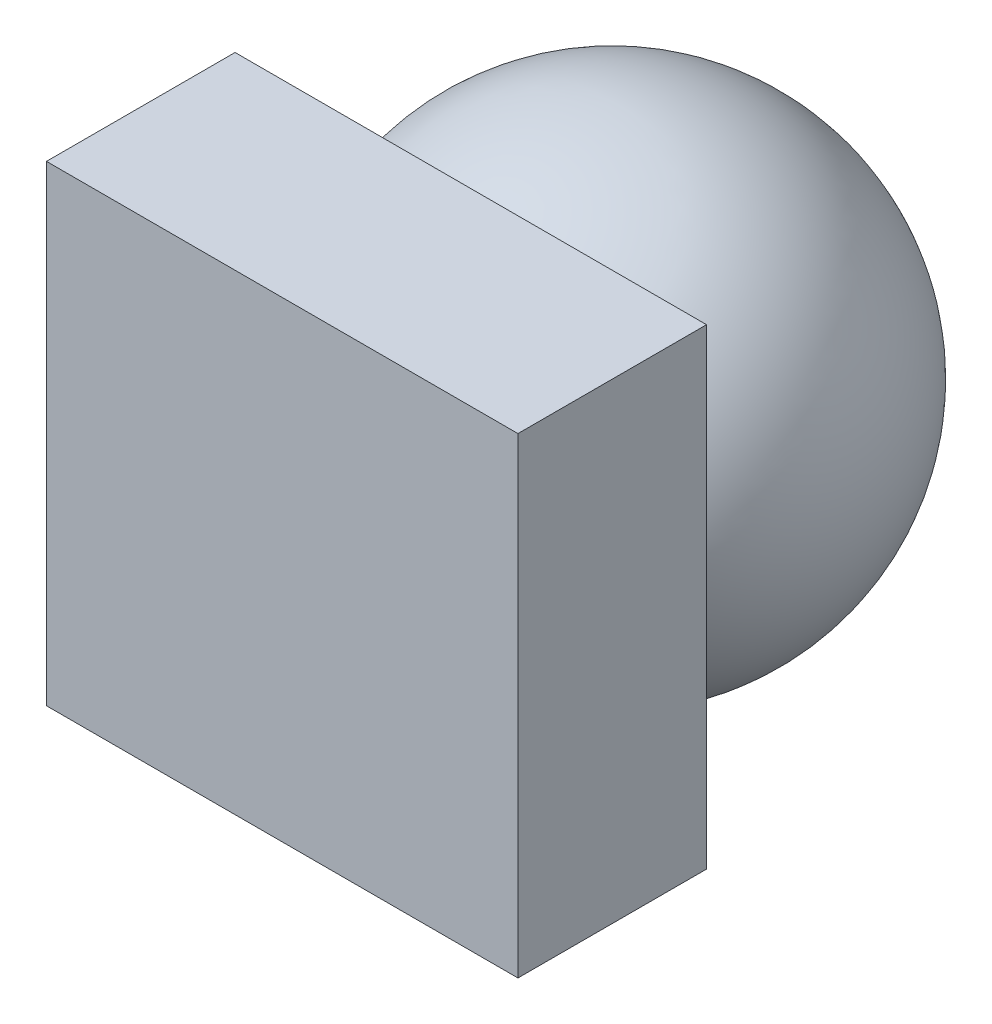
ISO-10303-21;
HEADER;
FILE_DESCRIPTION(('STEP AP214'),'2;1');
FILE_NAME('part.step','',(''),(''),'','','');
FILE_SCHEMA(('AUTOMOTIVE_DESIGN { 1 0 10303 214 1 1 1 1 }'));
ENDSEC;
DATA;
#1=APPLICATION_CONTEXT('core data for automotive mechanical design processes');
#2=APPLICATION_PROTOCOL_DEFINITION('international standard','automotive_design',2000,#1);
#3=PRODUCT_CONTEXT('',#1,'mechanical');
#4=PRODUCT('Part','Part','',(#3));
#5=PRODUCT_RELATED_PRODUCT_CATEGORY('part','',(#4));
#6=PRODUCT_DEFINITION_FORMATION('','',#4);
#7=PRODUCT_DEFINITION_CONTEXT('part definition',#1,'design');
#8=PRODUCT_DEFINITION('design','',#6,#7);
#9=PRODUCT_DEFINITION_SHAPE('','',#8);
#10=(LENGTH_UNIT() NAMED_UNIT(*) SI_UNIT(.MILLI.,.METRE.));
#11=(NAMED_UNIT(*) PLANE_ANGLE_UNIT() SI_UNIT($,.RADIAN.));
#12=(NAMED_UNIT(*) SI_UNIT($,.STERADIAN.) SOLID_ANGLE_UNIT());
#13=UNCERTAINTY_MEASURE_WITH_UNIT(LENGTH_MEASURE(1.E-05),#10,'distance_accuracy_value','');
#14=(GEOMETRIC_REPRESENTATION_CONTEXT(3) GLOBAL_UNCERTAINTY_ASSIGNED_CONTEXT((#13)) GLOBAL_UNIT_ASSIGNED_CONTEXT((#10,
#11,#12)) REPRESENTATION_CONTEXT('',''));
#15=CARTESIAN_POINT('',(0.,0.,0.));
#16=DIRECTION('',(0.,0.,1.));
#17=DIRECTION('',(1.,0.,0.));
#18=AXIS2_PLACEMENT_3D('',#15,#16,#17);
#19=CARTESIAN_POINT('',(0.,0.,10.));
#20=DIRECTION('',(1.,0.,0.));
#21=DIRECTION('',(0.,1.,0.));
#22=AXIS2_PLACEMENT_3D('',#19,#20,#21);
#23=PLANE('',#22);
#24=DIRECTION('',(0.,-1.,0.));
#25=VECTOR('',#24,1.);
#26=CARTESIAN_POINT('',(0.,0.,0.));
#27=LINE('',#26,#25);
#28=CARTESIAN_POINT('',(0.,25.,0.));
#29=VERTEX_POINT('',#28);
#30=CARTESIAN_POINT('',(0.,0.,0.));
#31=VERTEX_POINT('',#30);
#32=EDGE_CURVE('E108',#29,#31,#27,.T.);
#33=ORIENTED_EDGE('',*,*,#32,.T.);
#34=DIRECTION('',(0.,0.,-1.));
#35=VECTOR('',#34,1.);
#36=CARTESIAN_POINT('',(0.,0.,10.));
#37=LINE('',#36,#35);
#38=CARTESIAN_POINT('',(0.,0.,10.));
#39=VERTEX_POINT('',#38);
#40=EDGE_CURVE('E11',#39,#31,#37,.T.);
#41=ORIENTED_EDGE('',*,*,#40,.F.);
#42=DIRECTION('',(0.,-1.,0.));
#43=VECTOR('',#42,1.);
#44=CARTESIAN_POINT('',(0.,0.,10.));
#45=LINE('',#44,#43);
#46=CARTESIAN_POINT('',(0.,25.,10.));
#47=VERTEX_POINT('',#46);
#48=EDGE_CURVE('E95',#47,#39,#45,.T.);
#49=ORIENTED_EDGE('',*,*,#48,.F.);
#50=DIRECTION('',(0.,0.,-1.));
#51=VECTOR('',#50,1.);
#52=CARTESIAN_POINT('',(0.,25.,10.));
#53=LINE('',#52,#51);
#54=EDGE_CURVE('E104',#47,#29,#53,.T.);
#55=ORIENTED_EDGE('',*,*,#54,.T.);
#56=EDGE_LOOP('',(#33,#41,#49,#55));
#57=FACE_BOUND('',#56,.T.);
#58=ADVANCED_FACE('F43',(#57),#23,.F.);
#59=CARTESIAN_POINT('',(0.,0.,10.));
#60=DIRECTION('',(0.,1.,0.));
#61=DIRECTION('',(0.,0.,1.));
#62=AXIS2_PLACEMENT_3D('',#59,#60,#61);
#63=PLANE('',#62);
#64=DIRECTION('',(1.,0.,0.));
#65=VECTOR('',#64,1.);
#66=CARTESIAN_POINT('',(0.,0.,0.));
#67=LINE('',#66,#65);
#68=CARTESIAN_POINT('',(25.,0.,0.));
#69=VERTEX_POINT('',#68);
#70=EDGE_CURVE('E99',#31,#69,#67,.T.);
#71=ORIENTED_EDGE('',*,*,#70,.T.);
#72=DIRECTION('',(0.,0.,-1.));
#73=VECTOR('',#72,1.);
#74=CARTESIAN_POINT('',(25.,0.,10.));
#75=LINE('',#74,#73);
#76=CARTESIAN_POINT('',(25.,0.,10.));
#77=VERTEX_POINT('',#76);
#78=EDGE_CURVE('E52',#77,#69,#75,.T.);
#79=ORIENTED_EDGE('',*,*,#78,.F.);
#80=DIRECTION('',(1.,0.,0.));
#81=VECTOR('',#80,1.);
#82=CARTESIAN_POINT('',(0.,0.,10.));
#83=LINE('',#82,#81);
#84=EDGE_CURVE('E90',#39,#77,#83,.T.);
#85=ORIENTED_EDGE('',*,*,#84,.F.);
#86=ORIENTED_EDGE('',*,*,#40,.T.);
#87=EDGE_LOOP('',(#71,#79,#85,#86));
#88=FACE_BOUND('',#87,.T.);
#89=ADVANCED_FACE('F98',(#88),#63,.F.);
#90=CARTESIAN_POINT('',(25.,0.,10.));
#91=DIRECTION('',(-1.,0.,0.));
#92=DIRECTION('',(0.,-1.,0.));
#93=AXIS2_PLACEMENT_3D('',#90,#91,#92);
#94=PLANE('',#93);
#95=DIRECTION('',(0.,1.,0.));
#96=VECTOR('',#95,1.);
#97=CARTESIAN_POINT('',(25.,0.,0.));
#98=LINE('',#97,#96);
#99=CARTESIAN_POINT('',(25.,25.,0.));
#100=VERTEX_POINT('',#99);
#101=EDGE_CURVE('E77',#69,#100,#98,.T.);
#102=ORIENTED_EDGE('',*,*,#101,.T.);
#103=DIRECTION('',(0.,0.,-1.));
#104=VECTOR('',#103,1.);
#105=CARTESIAN_POINT('',(25.,25.,10.));
#106=LINE('',#105,#104);
#107=CARTESIAN_POINT('',(25.,25.,10.));
#108=VERTEX_POINT('',#107);
#109=EDGE_CURVE('E100',#108,#100,#106,.T.);
#110=ORIENTED_EDGE('',*,*,#109,.F.);
#111=DIRECTION('',(0.,1.,0.));
#112=VECTOR('',#111,1.);
#113=CARTESIAN_POINT('',(25.,0.,10.));
#114=LINE('',#113,#112);
#115=EDGE_CURVE('E93',#77,#108,#114,.T.);
#116=ORIENTED_EDGE('',*,*,#115,.F.);
#117=ORIENTED_EDGE('',*,*,#78,.T.);
#118=EDGE_LOOP('',(#102,#110,#116,#117));
#119=FACE_BOUND('',#118,.T.);
#120=ADVANCED_FACE('F102',(#119),#94,.F.);
#121=CARTESIAN_POINT('',(0.,25.,10.));
#122=DIRECTION('',(0.,-1.,0.));
#123=DIRECTION('',(0.,0.,-1.));
#124=AXIS2_PLACEMENT_3D('',#121,#122,#123);
#125=PLANE('',#124);
#126=DIRECTION('',(-1.,0.,0.));
#127=VECTOR('',#126,1.);
#128=CARTESIAN_POINT('',(0.,25.,0.));
#129=LINE('',#128,#127);
#130=EDGE_CURVE('E83',#100,#29,#129,.T.);
#131=ORIENTED_EDGE('',*,*,#130,.T.);
#132=ORIENTED_EDGE('',*,*,#54,.F.);
#133=DIRECTION('',(-1.,0.,0.));
#134=VECTOR('',#133,1.);
#135=CARTESIAN_POINT('',(0.,25.,10.));
#136=LINE('',#135,#134);
#137=EDGE_CURVE('E60',#108,#47,#136,.T.);
#138=ORIENTED_EDGE('',*,*,#137,.F.);
#139=ORIENTED_EDGE('',*,*,#109,.T.);
#140=EDGE_LOOP('',(#131,#132,#138,#139));
#141=FACE_BOUND('',#140,.T.);
#142=ADVANCED_FACE('F115',(#141),#125,.F.);
#143=CARTESIAN_POINT('',(0.,0.,10.));
#144=DIRECTION('',(0.,0.,-1.));
#145=DIRECTION('',(-1.,0.,0.));
#146=AXIS2_PLACEMENT_3D('',#143,#144,#145);
#147=PLANE('',#146);
#148=ORIENTED_EDGE('',*,*,#48,.T.);
#149=ORIENTED_EDGE('',*,*,#84,.T.);
#150=ORIENTED_EDGE('',*,*,#115,.T.);
#151=ORIENTED_EDGE('',*,*,#137,.T.);
#152=EDGE_LOOP('',(#148,#149,#150,#151));
#153=FACE_BOUND('',#152,.T.);
#154=ADVANCED_FACE('F91',(#153),#147,.F.);
#155=CARTESIAN_POINT('',(0.,0.,0.));
#156=DIRECTION('',(0.,0.,-1.));
#157=DIRECTION('',(-1.,0.,0.));
#158=AXIS2_PLACEMENT_3D('',#155,#156,#157);
#159=PLANE('',#158);
#160=CARTESIAN_POINT('',(12.5,12.5,0.));
#161=DIRECTION('',(0.,0.,-1.));
#162=DIRECTION('',(-1.,0.,0.));
#163=AXIS2_PLACEMENT_3D('',#160,#161,#162);
#164=CIRCLE('',#163,10.);
#165=CARTESIAN_POINT('',(2.5,12.5,0.));
#166=VERTEX_POINT('',#165);
#167=EDGE_CURVE('E46',#166,#166,#164,.F.);
#168=ORIENTED_EDGE('',*,*,#167,.T.);
#169=EDGE_LOOP('',(#168));
#170=FACE_BOUND('',#169,.T.);
#171=ORIENTED_EDGE('',*,*,#32,.F.);
#172=ORIENTED_EDGE('',*,*,#130,.F.);
#173=ORIENTED_EDGE('',*,*,#101,.F.);
#174=ORIENTED_EDGE('',*,*,#70,.F.);
#175=EDGE_LOOP('',(#171,#172,#173,#174));
#176=FACE_BOUND('',#175,.T.);
#177=ADVANCED_FACE('F118',(#170,#176),#159,.T.);
#178=CARTESIAN_POINT('',(12.5,12.5,-7.5));
#179=DIRECTION('',(0.,0.,-1.));
#180=DIRECTION('',(-1.,0.,0.));
#181=AXIS2_PLACEMENT_3D('',#178,#179,#180);
#182=SPHERICAL_SURFACE('',#181,12.5);
#183=ORIENTED_EDGE('',*,*,#167,.F.);
#184=EDGE_LOOP('',(#183));
#185=FACE_BOUND('',#184,.T.);
#186=ADVANCED_FACE('F133',(#185),#182,.T.);
#187=CLOSED_SHELL('',(#58,#89,#120,#142,#154,#177,#186));
#188=MANIFOLD_SOLID_BREP('B2',#187);
#189=ADVANCED_BREP_SHAPE_REPRESENTATION('',(#18,#188),#14);
#190=SHAPE_DEFINITION_REPRESENTATION(#9,#189);
ENDSEC;
END-ISO-10303-21;
